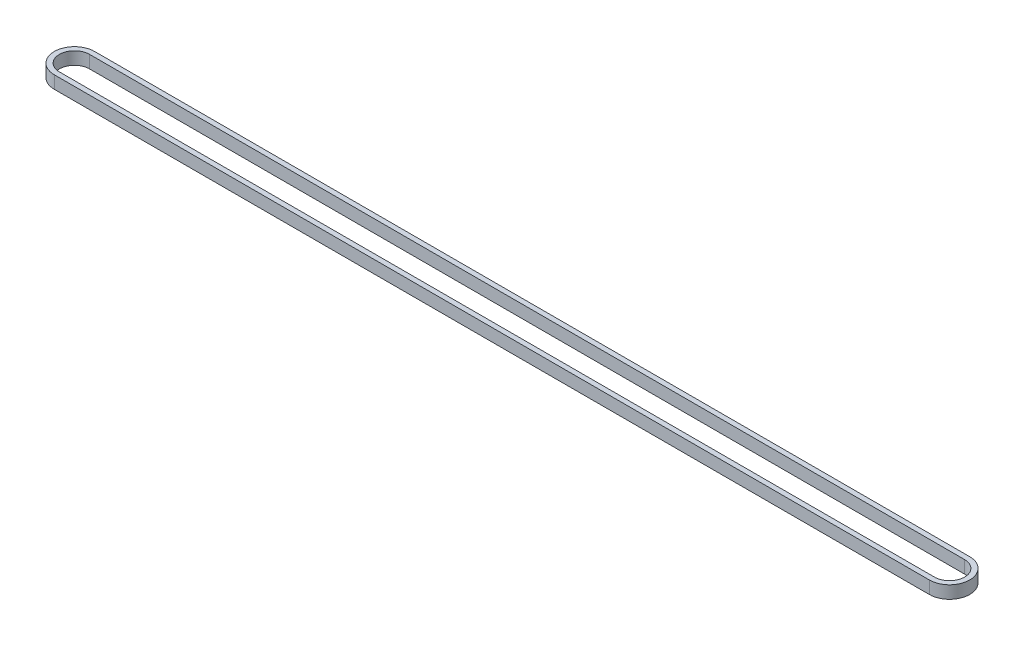
ISO-10303-21;
HEADER;
FILE_DESCRIPTION(('STEP AP214'),'2;1');
FILE_NAME('part.step','',(''),(''),'','','');
FILE_SCHEMA(('AUTOMOTIVE_DESIGN { 1 0 10303 214 1 1 1 1 }'));
ENDSEC;
DATA;
#1=APPLICATION_CONTEXT('core data for automotive mechanical design processes');
#2=APPLICATION_PROTOCOL_DEFINITION('international standard','automotive_design',2000,#1);
#3=PRODUCT_CONTEXT('',#1,'mechanical');
#4=PRODUCT('Part','Part','',(#3));
#5=PRODUCT_RELATED_PRODUCT_CATEGORY('part','',(#4));
#6=PRODUCT_DEFINITION_FORMATION('','',#4);
#7=PRODUCT_DEFINITION_CONTEXT('part definition',#1,'design');
#8=PRODUCT_DEFINITION('design','',#6,#7);
#9=PRODUCT_DEFINITION_SHAPE('','',#8);
#10=(LENGTH_UNIT() NAMED_UNIT(*) SI_UNIT(.MILLI.,.METRE.));
#11=(NAMED_UNIT(*) PLANE_ANGLE_UNIT() SI_UNIT($,.RADIAN.));
#12=(NAMED_UNIT(*) SI_UNIT($,.STERADIAN.) SOLID_ANGLE_UNIT());
#13=UNCERTAINTY_MEASURE_WITH_UNIT(LENGTH_MEASURE(1.E-05),#10,'distance_accuracy_value','');
#14=(GEOMETRIC_REPRESENTATION_CONTEXT(3) GLOBAL_UNCERTAINTY_ASSIGNED_CONTEXT((#13)) GLOBAL_UNIT_ASSIGNED_CONTEXT((#10,
#11,#12)) REPRESENTATION_CONTEXT('',''));
#15=CARTESIAN_POINT('',(0.,0.,0.));
#16=DIRECTION('',(0.,0.,1.));
#17=DIRECTION('',(1.,0.,0.));
#18=AXIS2_PLACEMENT_3D('',#15,#16,#17);
#19=CARTESIAN_POINT('',(39.267874125526,5.,-65.0224656768684));
#20=DIRECTION('',(0.,1.,0.));
#21=DIRECTION('',(0.,0.,1.));
#22=AXIS2_PLACEMENT_3D('',#19,#20,#21);
#23=PLANE('',#22);
#24=CARTESIAN_POINT('',(39.267874125526,5.,-65.0224656768684));
#25=DIRECTION('',(0.,1.,0.));
#26=DIRECTION('',(0.,0.,1.));
#27=AXIS2_PLACEMENT_3D('',#24,#25,#26);
#28=CIRCLE('',#27,8.);
#29=CARTESIAN_POINT('',(39.267874125526,5.,-73.0224656768684));
#30=VERTEX_POINT('',#29);
#31=CARTESIAN_POINT('',(39.267874125526,5.,-57.0224656768684));
#32=VERTEX_POINT('',#31);
#33=EDGE_CURVE('E152',#30,#32,#28,.T.);
#34=ORIENTED_EDGE('',*,*,#33,.T.);
#35=DIRECTION('',(1.,0.,0.));
#36=VECTOR('',#35,1.);
#37=CARTESIAN_POINT('',(39.267874125526,5.,-57.0224656768684));
#38=LINE('',#37,#36);
#39=CARTESIAN_POINT('',(386.267874125526,5.,-57.0224656768684));
#40=VERTEX_POINT('',#39);
#41=EDGE_CURVE('E156',#32,#40,#38,.T.);
#42=ORIENTED_EDGE('',*,*,#41,.T.);
#43=CARTESIAN_POINT('',(386.267874125526,5.,-65.0224656768684));
#44=DIRECTION('',(0.,1.,0.));
#45=DIRECTION('',(0.,0.,1.));
#46=AXIS2_PLACEMENT_3D('',#43,#44,#45);
#47=CIRCLE('',#46,8.00000000000001);
#48=CARTESIAN_POINT('',(386.267874125526,5.,-73.0224656768684));
#49=VERTEX_POINT('',#48);
#50=EDGE_CURVE('E160',#40,#49,#47,.T.);
#51=ORIENTED_EDGE('',*,*,#50,.T.);
#52=DIRECTION('',(-1.,0.,0.));
#53=VECTOR('',#52,1.);
#54=CARTESIAN_POINT('',(39.267874125526,5.,-73.0224656768684));
#55=LINE('',#54,#53);
#56=EDGE_CURVE('E163',#49,#30,#55,.T.);
#57=ORIENTED_EDGE('',*,*,#56,.T.);
#58=EDGE_LOOP('',(#34,#42,#51,#57));
#59=FACE_BOUND('',#58,.T.);
#60=DIRECTION('',(1.,0.,0.));
#61=VECTOR('',#60,1.);
#62=CARTESIAN_POINT('',(39.267874125526,5.,-59.0224656768684));
#63=LINE('',#62,#61);
#64=CARTESIAN_POINT('',(39.267874125526,5.,-59.0224656768684));
#65=VERTEX_POINT('',#64);
#66=CARTESIAN_POINT('',(386.267874125526,5.,-59.0224656768684));
#67=VERTEX_POINT('',#66);
#68=EDGE_CURVE('E111',#65,#67,#63,.T.);
#69=ORIENTED_EDGE('',*,*,#68,.F.);
#70=CARTESIAN_POINT('',(39.267874125526,5.,-65.0224656768684));
#71=DIRECTION('',(0.,1.,0.));
#72=DIRECTION('',(0.,0.,1.));
#73=AXIS2_PLACEMENT_3D('',#70,#71,#72);
#74=CIRCLE('',#73,6.);
#75=CARTESIAN_POINT('',(39.267874125526,5.,-71.0224656768684));
#76=VERTEX_POINT('',#75);
#77=EDGE_CURVE('E102',#76,#65,#74,.T.);
#78=ORIENTED_EDGE('',*,*,#77,.F.);
#79=DIRECTION('',(-1.,0.,0.));
#80=VECTOR('',#79,1.);
#81=CARTESIAN_POINT('',(39.267874125526,5.,-71.0224656768684));
#82=LINE('',#81,#80);
#83=CARTESIAN_POINT('',(386.267874125526,5.,-71.0224656768684));
#84=VERTEX_POINT('',#83);
#85=EDGE_CURVE('E130',#84,#76,#82,.T.);
#86=ORIENTED_EDGE('',*,*,#85,.F.);
#87=CARTESIAN_POINT('',(386.267874125526,5.,-65.0224656768684));
#88=DIRECTION('',(0.,1.,0.));
#89=DIRECTION('',(0.,0.,1.));
#90=AXIS2_PLACEMENT_3D('',#87,#88,#89);
#91=CIRCLE('',#90,6.);
#92=EDGE_CURVE('E124',#67,#84,#91,.T.);
#93=ORIENTED_EDGE('',*,*,#92,.F.);
#94=EDGE_LOOP('',(#69,#78,#86,#93));
#95=FACE_BOUND('',#94,.T.);
#96=ADVANCED_FACE('F36',(#59,#95),#23,.T.);
#97=CARTESIAN_POINT('',(39.267874125526,0.,-65.0224656768684));
#98=DIRECTION('',(0.,1.,0.));
#99=DIRECTION('',(0.,0.,1.));
#100=AXIS2_PLACEMENT_3D('',#97,#98,#99);
#101=PLANE('',#100);
#102=CARTESIAN_POINT('',(39.267874125526,0.,-65.0224656768684));
#103=DIRECTION('',(0.,1.,0.));
#104=DIRECTION('',(0.,0.,1.));
#105=AXIS2_PLACEMENT_3D('',#102,#103,#104);
#106=CIRCLE('',#105,8.);
#107=CARTESIAN_POINT('',(39.267874125526,0.,-73.0224656768684));
#108=VERTEX_POINT('',#107);
#109=CARTESIAN_POINT('',(39.267874125526,0.,-57.0224656768684));
#110=VERTEX_POINT('',#109);
#111=EDGE_CURVE('E120',#108,#110,#106,.T.);
#112=ORIENTED_EDGE('',*,*,#111,.F.);
#113=DIRECTION('',(-1.,0.,0.));
#114=VECTOR('',#113,1.);
#115=CARTESIAN_POINT('',(39.267874125526,0.,-73.0224656768684));
#116=LINE('',#115,#114);
#117=CARTESIAN_POINT('',(386.267874125526,0.,-73.0224656768684));
#118=VERTEX_POINT('',#117);
#119=EDGE_CURVE('E157',#118,#108,#116,.T.);
#120=ORIENTED_EDGE('',*,*,#119,.F.);
#121=CARTESIAN_POINT('',(386.267874125526,0.,-65.0224656768684));
#122=DIRECTION('',(0.,1.,0.));
#123=DIRECTION('',(0.,0.,1.));
#124=AXIS2_PLACEMENT_3D('',#121,#122,#123);
#125=CIRCLE('',#124,8.00000000000001);
#126=CARTESIAN_POINT('',(386.267874125526,0.,-57.0224656768684));
#127=VERTEX_POINT('',#126);
#128=EDGE_CURVE('E173',#127,#118,#125,.T.);
#129=ORIENTED_EDGE('',*,*,#128,.F.);
#130=DIRECTION('',(1.,0.,0.));
#131=VECTOR('',#130,1.);
#132=CARTESIAN_POINT('',(39.267874125526,0.,-57.0224656768684));
#133=LINE('',#132,#131);
#134=EDGE_CURVE('E170',#110,#127,#133,.T.);
#135=ORIENTED_EDGE('',*,*,#134,.F.);
#136=EDGE_LOOP('',(#112,#120,#129,#135));
#137=FACE_BOUND('',#136,.T.);
#138=CARTESIAN_POINT('',(39.267874125526,0.,-65.0224656768684));
#139=DIRECTION('',(0.,1.,0.));
#140=DIRECTION('',(0.,0.,1.));
#141=AXIS2_PLACEMENT_3D('',#138,#139,#140);
#142=CIRCLE('',#141,6.);
#143=CARTESIAN_POINT('',(39.267874125526,0.,-71.0224656768684));
#144=VERTEX_POINT('',#143);
#145=CARTESIAN_POINT('',(39.267874125526,0.,-59.0224656768684));
#146=VERTEX_POINT('',#145);
#147=EDGE_CURVE('E60',#144,#146,#142,.T.);
#148=ORIENTED_EDGE('',*,*,#147,.T.);
#149=DIRECTION('',(1.,0.,0.));
#150=VECTOR('',#149,1.);
#151=CARTESIAN_POINT('',(39.267874125526,0.,-59.0224656768684));
#152=LINE('',#151,#150);
#153=CARTESIAN_POINT('',(386.267874125526,0.,-59.0224656768684));
#154=VERTEX_POINT('',#153);
#155=EDGE_CURVE('E118',#146,#154,#152,.T.);
#156=ORIENTED_EDGE('',*,*,#155,.T.);
#157=CARTESIAN_POINT('',(386.267874125526,0.,-65.0224656768684));
#158=DIRECTION('',(0.,1.,0.));
#159=DIRECTION('',(0.,0.,1.));
#160=AXIS2_PLACEMENT_3D('',#157,#158,#159);
#161=CIRCLE('',#160,6.);
#162=CARTESIAN_POINT('',(386.267874125526,0.,-71.0224656768684));
#163=VERTEX_POINT('',#162);
#164=EDGE_CURVE('E139',#154,#163,#161,.T.);
#165=ORIENTED_EDGE('',*,*,#164,.T.);
#166=DIRECTION('',(-1.,0.,0.));
#167=VECTOR('',#166,1.);
#168=CARTESIAN_POINT('',(39.267874125526,0.,-71.0224656768684));
#169=LINE('',#168,#167);
#170=EDGE_CURVE('E112',#163,#144,#169,.T.);
#171=ORIENTED_EDGE('',*,*,#170,.T.);
#172=EDGE_LOOP('',(#148,#156,#165,#171));
#173=FACE_BOUND('',#172,.T.);
#174=ADVANCED_FACE('F194',(#137,#173),#101,.F.);
#175=CARTESIAN_POINT('',(39.267874125526,5.,-65.0224656768684));
#176=DIRECTION('',(0.,-1.,0.));
#177=DIRECTION('',(0.,0.,-1.));
#178=AXIS2_PLACEMENT_3D('',#175,#176,#177);
#179=CYLINDRICAL_SURFACE('',#178,8.);
#180=ORIENTED_EDGE('',*,*,#111,.T.);
#181=DIRECTION('',(0.,-1.,0.));
#182=VECTOR('',#181,1.);
#183=CARTESIAN_POINT('',(39.267874125526,5.,-57.0224656768684));
#184=LINE('',#183,#182);
#185=EDGE_CURVE('E11',#32,#110,#184,.T.);
#186=ORIENTED_EDGE('',*,*,#185,.F.);
#187=ORIENTED_EDGE('',*,*,#33,.F.);
#188=DIRECTION('',(0.,-1.,0.));
#189=VECTOR('',#188,1.);
#190=CARTESIAN_POINT('',(39.267874125526,5.,-73.0224656768684));
#191=LINE('',#190,#189);
#192=EDGE_CURVE('E166',#30,#108,#191,.T.);
#193=ORIENTED_EDGE('',*,*,#192,.T.);
#194=EDGE_LOOP('',(#180,#186,#187,#193));
#195=FACE_BOUND('',#194,.T.);
#196=ADVANCED_FACE('F38',(#195),#179,.T.);
#197=CARTESIAN_POINT('',(39.267874125526,5.,-57.0224656768684));
#198=DIRECTION('',(0.,0.,-1.));
#199=DIRECTION('',(-1.,0.,0.));
#200=AXIS2_PLACEMENT_3D('',#197,#198,#199);
#201=PLANE('',#200);
#202=ORIENTED_EDGE('',*,*,#134,.T.);
#203=DIRECTION('',(0.,-1.,0.));
#204=VECTOR('',#203,1.);
#205=CARTESIAN_POINT('',(386.267874125526,5.,-57.0224656768684));
#206=LINE('',#205,#204);
#207=EDGE_CURVE('E45',#40,#127,#206,.T.);
#208=ORIENTED_EDGE('',*,*,#207,.F.);
#209=ORIENTED_EDGE('',*,*,#41,.F.);
#210=ORIENTED_EDGE('',*,*,#185,.T.);
#211=EDGE_LOOP('',(#202,#208,#209,#210));
#212=FACE_BOUND('',#211,.T.);
#213=ADVANCED_FACE('F204',(#212),#201,.F.);
#214=CARTESIAN_POINT('',(386.267874125526,5.,-65.0224656768684));
#215=DIRECTION('',(0.,-1.,0.));
#216=DIRECTION('',(0.,0.,-1.));
#217=AXIS2_PLACEMENT_3D('',#214,#215,#216);
#218=CYLINDRICAL_SURFACE('',#217,8.00000000000001);
#219=ORIENTED_EDGE('',*,*,#128,.T.);
#220=DIRECTION('',(0.,-1.,0.));
#221=VECTOR('',#220,1.);
#222=CARTESIAN_POINT('',(386.267874125526,5.,-73.0224656768684));
#223=LINE('',#222,#221);
#224=EDGE_CURVE('E180',#49,#118,#223,.T.);
#225=ORIENTED_EDGE('',*,*,#224,.F.);
#226=ORIENTED_EDGE('',*,*,#50,.F.);
#227=ORIENTED_EDGE('',*,*,#207,.T.);
#228=EDGE_LOOP('',(#219,#225,#226,#227));
#229=FACE_BOUND('',#228,.T.);
#230=ADVANCED_FACE('F188',(#229),#218,.T.);
#231=CARTESIAN_POINT('',(39.267874125526,5.,-73.0224656768684));
#232=DIRECTION('',(0.,0.,1.));
#233=DIRECTION('',(1.,0.,0.));
#234=AXIS2_PLACEMENT_3D('',#231,#232,#233);
#235=PLANE('',#234);
#236=ORIENTED_EDGE('',*,*,#119,.T.);
#237=ORIENTED_EDGE('',*,*,#192,.F.);
#238=ORIENTED_EDGE('',*,*,#56,.F.);
#239=ORIENTED_EDGE('',*,*,#224,.T.);
#240=EDGE_LOOP('',(#236,#237,#238,#239));
#241=FACE_BOUND('',#240,.T.);
#242=ADVANCED_FACE('F198',(#241),#235,.F.);
#243=CARTESIAN_POINT('',(39.267874125526,5.,-65.0224656768684));
#244=DIRECTION('',(0.,-1.,0.));
#245=DIRECTION('',(0.,0.,-1.));
#246=AXIS2_PLACEMENT_3D('',#243,#244,#245);
#247=CYLINDRICAL_SURFACE('',#246,6.);
#248=ORIENTED_EDGE('',*,*,#147,.F.);
#249=DIRECTION('',(0.,-1.,0.));
#250=VECTOR('',#249,1.);
#251=CARTESIAN_POINT('',(39.267874125526,5.,-71.0224656768684));
#252=LINE('',#251,#250);
#253=EDGE_CURVE('E106',#76,#144,#252,.T.);
#254=ORIENTED_EDGE('',*,*,#253,.F.);
#255=ORIENTED_EDGE('',*,*,#77,.T.);
#256=DIRECTION('',(0.,-1.,0.));
#257=VECTOR('',#256,1.);
#258=CARTESIAN_POINT('',(39.267874125526,5.,-59.0224656768684));
#259=LINE('',#258,#257);
#260=EDGE_CURVE('E105',#65,#146,#259,.T.);
#261=ORIENTED_EDGE('',*,*,#260,.T.);
#262=EDGE_LOOP('',(#248,#254,#255,#261));
#263=FACE_BOUND('',#262,.T.);
#264=ADVANCED_FACE('F104',(#263),#247,.F.);
#265=CARTESIAN_POINT('',(39.267874125526,5.,-59.0224656768684));
#266=DIRECTION('',(0.,0.,-1.));
#267=DIRECTION('',(-1.,0.,0.));
#268=AXIS2_PLACEMENT_3D('',#265,#266,#267);
#269=PLANE('',#268);
#270=ORIENTED_EDGE('',*,*,#155,.F.);
#271=ORIENTED_EDGE('',*,*,#260,.F.);
#272=ORIENTED_EDGE('',*,*,#68,.T.);
#273=DIRECTION('',(0.,-1.,0.));
#274=VECTOR('',#273,1.);
#275=CARTESIAN_POINT('',(386.267874125526,5.,-59.0224656768684));
#276=LINE('',#275,#274);
#277=EDGE_CURVE('E121',#67,#154,#276,.T.);
#278=ORIENTED_EDGE('',*,*,#277,.T.);
#279=EDGE_LOOP('',(#270,#271,#272,#278));
#280=FACE_BOUND('',#279,.T.);
#281=ADVANCED_FACE('F115',(#280),#269,.T.);
#282=CARTESIAN_POINT('',(386.267874125526,5.,-65.0224656768684));
#283=DIRECTION('',(0.,-1.,0.));
#284=DIRECTION('',(0.,0.,-1.));
#285=AXIS2_PLACEMENT_3D('',#282,#283,#284);
#286=CYLINDRICAL_SURFACE('',#285,6.);
#287=ORIENTED_EDGE('',*,*,#164,.F.);
#288=ORIENTED_EDGE('',*,*,#277,.F.);
#289=ORIENTED_EDGE('',*,*,#92,.T.);
#290=DIRECTION('',(0.,-1.,0.));
#291=VECTOR('',#290,1.);
#292=CARTESIAN_POINT('',(386.267874125526,5.,-71.0224656768684));
#293=LINE('',#292,#291);
#294=EDGE_CURVE('E52',#84,#163,#293,.T.);
#295=ORIENTED_EDGE('',*,*,#294,.T.);
#296=EDGE_LOOP('',(#287,#288,#289,#295));
#297=FACE_BOUND('',#296,.T.);
#298=ADVANCED_FACE('F227',(#297),#286,.F.);
#299=CARTESIAN_POINT('',(39.267874125526,5.,-71.0224656768684));
#300=DIRECTION('',(0.,0.,1.));
#301=DIRECTION('',(1.,0.,0.));
#302=AXIS2_PLACEMENT_3D('',#299,#300,#301);
#303=PLANE('',#302);
#304=ORIENTED_EDGE('',*,*,#170,.F.);
#305=ORIENTED_EDGE('',*,*,#294,.F.);
#306=ORIENTED_EDGE('',*,*,#85,.T.);
#307=ORIENTED_EDGE('',*,*,#253,.T.);
#308=EDGE_LOOP('',(#304,#305,#306,#307));
#309=FACE_BOUND('',#308,.T.);
#310=ADVANCED_FACE('F231',(#309),#303,.T.);
#311=CLOSED_SHELL('',(#96,#174,#196,#213,#230,#242,#264,#281,#298,#310));
#312=MANIFOLD_SOLID_BREP('B2',#311);
#313=ADVANCED_BREP_SHAPE_REPRESENTATION('',(#18,#312),#14);
#314=SHAPE_DEFINITION_REPRESENTATION(#9,#313);
ENDSEC;
END-ISO-10303-21;
